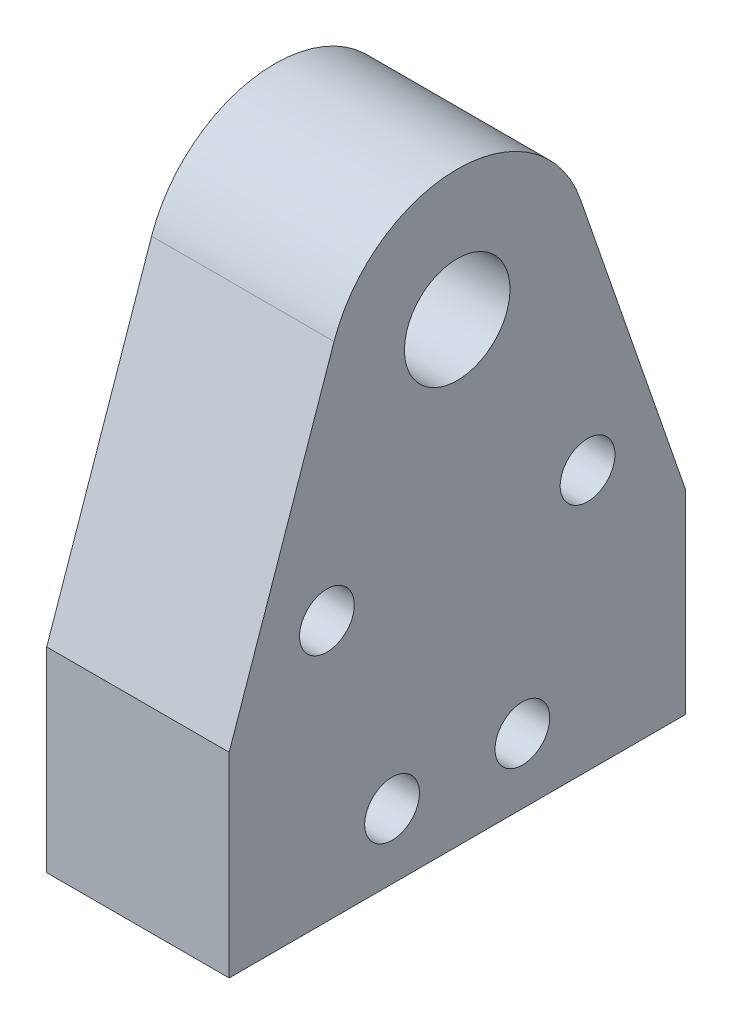
ISO-10303-21;
HEADER;
FILE_DESCRIPTION(('STEP AP214'),'2;1');
FILE_NAME('part.step','',(''),(''),'','','');
FILE_SCHEMA(('AUTOMOTIVE_DESIGN { 1 0 10303 214 1 1 1 1 }'));
ENDSEC;
DATA;
#1=APPLICATION_CONTEXT('core data for automotive mechanical design processes');
#2=APPLICATION_PROTOCOL_DEFINITION('international standard','automotive_design',2000,#1);
#3=PRODUCT_CONTEXT('',#1,'mechanical');
#4=PRODUCT('Part','Part','',(#3));
#5=PRODUCT_RELATED_PRODUCT_CATEGORY('part','',(#4));
#6=PRODUCT_DEFINITION_FORMATION('','',#4);
#7=PRODUCT_DEFINITION_CONTEXT('part definition',#1,'design');
#8=PRODUCT_DEFINITION('design','',#6,#7);
#9=PRODUCT_DEFINITION_SHAPE('','',#8);
#10=(LENGTH_UNIT() NAMED_UNIT(*) SI_UNIT(.MILLI.,.METRE.));
#11=(NAMED_UNIT(*) PLANE_ANGLE_UNIT() SI_UNIT($,.RADIAN.));
#12=(NAMED_UNIT(*) SI_UNIT($,.STERADIAN.) SOLID_ANGLE_UNIT());
#13=UNCERTAINTY_MEASURE_WITH_UNIT(LENGTH_MEASURE(1.E-05),#10,'distance_accuracy_value','');
#14=(GEOMETRIC_REPRESENTATION_CONTEXT(3) GLOBAL_UNCERTAINTY_ASSIGNED_CONTEXT((#13)) GLOBAL_UNIT_ASSIGNED_CONTEXT((#10,
#11,#12)) REPRESENTATION_CONTEXT('',''));
#15=CARTESIAN_POINT('',(0.,0.,0.));
#16=DIRECTION('',(0.,0.,1.));
#17=DIRECTION('',(1.,0.,0.));
#18=AXIS2_PLACEMENT_3D('',#15,#16,#17);
#19=CARTESIAN_POINT('',(-39.,35.,0.));
#20=DIRECTION('',(1.,0.,0.));
#21=DIRECTION('',(0.,0.,-1.));
#22=AXIS2_PLACEMENT_3D('',#19,#20,#21);
#23=CYLINDRICAL_SURFACE('',#22,4.05);
#24=CARTESIAN_POINT('',(7.,35.,0.));
#25=DIRECTION('',(1.,0.,0.));
#26=DIRECTION('',(0.,0.,-1.));
#27=AXIS2_PLACEMENT_3D('',#24,#25,#26);
#28=CIRCLE('',#27,4.05);
#29=CARTESIAN_POINT('',(7.,35.,-4.04999999999999));
#30=VERTEX_POINT('',#29);
#31=EDGE_CURVE('E181',#30,#30,#28,.T.);
#32=ORIENTED_EDGE('',*,*,#31,.T.);
#33=EDGE_LOOP('',(#32));
#34=FACE_BOUND('',#33,.T.);
#35=CARTESIAN_POINT('',(-5.,35.,0.));
#36=DIRECTION('',(-1.,0.,0.));
#37=DIRECTION('',(0.,0.,1.));
#38=AXIS2_PLACEMENT_3D('',#35,#36,#37);
#39=CIRCLE('',#38,4.05);
#40=CARTESIAN_POINT('',(-5.,35.,4.05000000000001));
#41=VERTEX_POINT('',#40);
#42=EDGE_CURVE('E12',#41,#41,#39,.F.);
#43=ORIENTED_EDGE('',*,*,#42,.F.);
#44=EDGE_LOOP('',(#43));
#45=FACE_BOUND('',#44,.T.);
#46=ADVANCED_FACE('F42',(#34,#45),#23,.F.);
#47=CARTESIAN_POINT('',(7.,60.,17.5));
#48=DIRECTION('',(-1.,0.,0.));
#49=DIRECTION('',(0.,0.,1.));
#50=AXIS2_PLACEMENT_3D('',#47,#48,#49);
#51=PLANE('',#50);
#52=CARTESIAN_POINT('',(7.,20.,10.));
#53=DIRECTION('',(1.,0.,0.));
#54=DIRECTION('',(0.,0.,-1.));
#55=AXIS2_PLACEMENT_3D('',#52,#53,#54);
#56=CIRCLE('',#55,2.1);
#57=CARTESIAN_POINT('',(7.,20.,7.9));
#58=VERTEX_POINT('',#57);
#59=EDGE_CURVE('E171',#58,#58,#56,.T.);
#60=ORIENTED_EDGE('',*,*,#59,.F.);
#61=EDGE_LOOP('',(#60));
#62=FACE_BOUND('',#61,.T.);
#63=CARTESIAN_POINT('',(7.,20.,-10.));
#64=DIRECTION('',(1.,0.,0.));
#65=DIRECTION('',(0.,0.,-1.));
#66=AXIS2_PLACEMENT_3D('',#63,#64,#65);
#67=CIRCLE('',#66,2.1);
#68=CARTESIAN_POINT('',(7.,20.,-12.1));
#69=VERTEX_POINT('',#68);
#70=EDGE_CURVE('E416',#69,#69,#67,.T.);
#71=ORIENTED_EDGE('',*,*,#70,.F.);
#72=EDGE_LOOP('',(#71));
#73=FACE_BOUND('',#72,.T.);
#74=CARTESIAN_POINT('',(7.,4.99999999999999,-5.));
#75=DIRECTION('',(1.,0.,0.));
#76=DIRECTION('',(0.,0.,-1.));
#77=AXIS2_PLACEMENT_3D('',#74,#75,#76);
#78=CIRCLE('',#77,2.1);
#79=CARTESIAN_POINT('',(7.,4.99999999999999,-7.1));
#80=VERTEX_POINT('',#79);
#81=EDGE_CURVE('E420',#80,#80,#78,.T.);
#82=ORIENTED_EDGE('',*,*,#81,.F.);
#83=EDGE_LOOP('',(#82));
#84=FACE_BOUND('',#83,.T.);
#85=CARTESIAN_POINT('',(7.,4.99999999999999,5.));
#86=DIRECTION('',(1.,0.,0.));
#87=DIRECTION('',(0.,0.,-1.));
#88=AXIS2_PLACEMENT_3D('',#85,#86,#87);
#89=CIRCLE('',#88,2.1);
#90=CARTESIAN_POINT('',(7.,4.99999999999999,2.9));
#91=VERTEX_POINT('',#90);
#92=EDGE_CURVE('E194',#91,#91,#89,.T.);
#93=ORIENTED_EDGE('',*,*,#92,.F.);
#94=EDGE_LOOP('',(#93));
#95=FACE_BOUND('',#94,.T.);
#96=ORIENTED_EDGE('',*,*,#31,.F.);
#97=EDGE_LOOP('',(#96));
#98=FACE_BOUND('',#97,.T.);
#99=CARTESIAN_POINT('',(7.,35.,0.));
#100=DIRECTION('',(1.,0.,0.));
#101=DIRECTION('',(0.,0.,-1.));
#102=AXIS2_PLACEMENT_3D('',#99,#100,#101);
#103=CIRCLE('',#102,10.);
#104=CARTESIAN_POINT('',(7.,38.2692039480153,-9.45051879773175));
#105=VERTEX_POINT('',#104);
#106=CARTESIAN_POINT('',(7.,38.2692039480153,9.45051879773176));
#107=VERTEX_POINT('',#106);
#108=EDGE_CURVE('E113',#105,#107,#103,.T.);
#109=ORIENTED_EDGE('',*,*,#108,.T.);
#110=DIRECTION('',(0.,0.945051879773176,-0.326920394801528));
#111=VECTOR('',#110,1.);
#112=CARTESIAN_POINT('',(7.,7.00989700681684,20.2640044752498));
#113=LINE('',#112,#111);
#114=CARTESIAN_POINT('',(7.,15.,17.5));
#115=VERTEX_POINT('',#114);
#116=EDGE_CURVE('E110',#115,#107,#113,.T.);
#117=ORIENTED_EDGE('',*,*,#116,.F.);
#118=DIRECTION('',(0.,-1.,0.));
#119=VECTOR('',#118,1.);
#120=CARTESIAN_POINT('',(7.,60.,17.5));
#121=LINE('',#120,#119);
#122=CARTESIAN_POINT('',(7.,0.,17.5));
#123=VERTEX_POINT('',#122);
#124=EDGE_CURVE('E66',#115,#123,#121,.T.);
#125=ORIENTED_EDGE('',*,*,#124,.T.);
#126=DIRECTION('',(0.,0.,-1.));
#127=VECTOR('',#126,1.);
#128=CARTESIAN_POINT('',(7.,0.,17.5));
#129=LINE('',#128,#127);
#130=CARTESIAN_POINT('',(7.,0.,-17.5));
#131=VERTEX_POINT('',#130);
#132=EDGE_CURVE('E139',#123,#131,#129,.T.);
#133=ORIENTED_EDGE('',*,*,#132,.T.);
#134=DIRECTION('',(0.,-1.,0.));
#135=VECTOR('',#134,1.);
#136=CARTESIAN_POINT('',(7.,60.,-17.5));
#137=LINE('',#136,#135);
#138=CARTESIAN_POINT('',(7.,15.,-17.5));
#139=VERTEX_POINT('',#138);
#140=EDGE_CURVE('E121',#139,#131,#137,.T.);
#141=ORIENTED_EDGE('',*,*,#140,.F.);
#142=DIRECTION('',(0.,-0.945051879773176,-0.326920394801529));
#143=VECTOR('',#142,1.);
#144=CARTESIAN_POINT('',(7.,7.00989700681685,-20.2640044752498));
#145=LINE('',#144,#143);
#146=EDGE_CURVE('E102',#105,#139,#145,.T.);
#147=ORIENTED_EDGE('',*,*,#146,.F.);
#148=EDGE_LOOP('',(#109,#117,#125,#133,#141,#147));
#149=FACE_BOUND('',#148,.T.);
#150=ADVANCED_FACE('F44',(#62,#73,#84,#95,#98,#149),#51,.F.);
#151=CARTESIAN_POINT('',(-7.,60.,-17.5));
#152=DIRECTION('',(0.,0.,1.));
#153=DIRECTION('',(1.,0.,0.));
#154=AXIS2_PLACEMENT_3D('',#151,#152,#153);
#155=PLANE('',#154);
#156=DIRECTION('',(0.,-1.,0.));
#157=VECTOR('',#156,1.);
#158=CARTESIAN_POINT('',(-7.,60.,-17.5));
#159=LINE('',#158,#157);
#160=CARTESIAN_POINT('',(-7.,15.,-17.5));
#161=VERTEX_POINT('',#160);
#162=CARTESIAN_POINT('',(-7.,0.,-17.5));
#163=VERTEX_POINT('',#162);
#164=EDGE_CURVE('E158',#161,#163,#159,.T.);
#165=ORIENTED_EDGE('',*,*,#164,.F.);
#166=DIRECTION('',(1.,0.,0.));
#167=VECTOR('',#166,1.);
#168=CARTESIAN_POINT('',(-53.,15.,-17.5));
#169=LINE('',#168,#167);
#170=EDGE_CURVE('E109',#161,#139,#169,.T.);
#171=ORIENTED_EDGE('',*,*,#170,.T.);
#172=ORIENTED_EDGE('',*,*,#140,.T.);
#173=DIRECTION('',(-1.,0.,0.));
#174=VECTOR('',#173,1.);
#175=CARTESIAN_POINT('',(-7.,0.,-17.5));
#176=LINE('',#175,#174);
#177=EDGE_CURVE('E142',#131,#163,#176,.T.);
#178=ORIENTED_EDGE('',*,*,#177,.T.);
#179=EDGE_LOOP('',(#165,#171,#172,#178));
#180=FACE_BOUND('',#179,.T.);
#181=ADVANCED_FACE('F228',(#180),#155,.F.);
#182=CARTESIAN_POINT('',(-7.,60.,17.5));
#183=DIRECTION('',(1.,0.,0.));
#184=DIRECTION('',(0.,0.,-1.));
#185=AXIS2_PLACEMENT_3D('',#182,#183,#184);
#186=PLANE('',#185);
#187=CARTESIAN_POINT('',(-7.00000000000001,20.,10.));
#188=DIRECTION('',(1.,0.,0.));
#189=DIRECTION('',(0.,0.,-1.));
#190=AXIS2_PLACEMENT_3D('',#187,#188,#189);
#191=CIRCLE('',#190,2.1);
#192=CARTESIAN_POINT('',(-7.00000000000001,20.,7.9));
#193=VERTEX_POINT('',#192);
#194=EDGE_CURVE('E178',#193,#193,#191,.T.);
#195=ORIENTED_EDGE('',*,*,#194,.T.);
#196=EDGE_LOOP('',(#195));
#197=FACE_BOUND('',#196,.T.);
#198=CARTESIAN_POINT('',(-7.00000000000001,20.,-10.));
#199=DIRECTION('',(1.,0.,0.));
#200=DIRECTION('',(0.,0.,-1.));
#201=AXIS2_PLACEMENT_3D('',#198,#199,#200);
#202=CIRCLE('',#201,2.1);
#203=CARTESIAN_POINT('',(-7.00000000000001,20.,-12.1));
#204=VERTEX_POINT('',#203);
#205=EDGE_CURVE('E175',#204,#204,#202,.T.);
#206=ORIENTED_EDGE('',*,*,#205,.T.);
#207=EDGE_LOOP('',(#206));
#208=FACE_BOUND('',#207,.T.);
#209=CARTESIAN_POINT('',(-7.00000000000001,4.99999999999999,-5.));
#210=DIRECTION('',(1.,0.,0.));
#211=DIRECTION('',(0.,0.,-1.));
#212=AXIS2_PLACEMENT_3D('',#209,#210,#211);
#213=CIRCLE('',#212,2.1);
#214=CARTESIAN_POINT('',(-7.00000000000001,4.99999999999999,-7.1));
#215=VERTEX_POINT('',#214);
#216=EDGE_CURVE('E170',#215,#215,#213,.T.);
#217=ORIENTED_EDGE('',*,*,#216,.T.);
#218=EDGE_LOOP('',(#217));
#219=FACE_BOUND('',#218,.T.);
#220=CARTESIAN_POINT('',(-7.00000000000001,4.99999999999999,5.));
#221=DIRECTION('',(1.,0.,0.));
#222=DIRECTION('',(0.,0.,-1.));
#223=AXIS2_PLACEMENT_3D('',#220,#221,#222);
#224=CIRCLE('',#223,2.1);
#225=CARTESIAN_POINT('',(-7.00000000000001,4.99999999999999,2.9));
#226=VERTEX_POINT('',#225);
#227=EDGE_CURVE('E166',#226,#226,#224,.T.);
#228=ORIENTED_EDGE('',*,*,#227,.T.);
#229=EDGE_LOOP('',(#228));
#230=FACE_BOUND('',#229,.T.);
#231=DIRECTION('',(0.,-1.,0.));
#232=VECTOR('',#231,1.);
#233=CARTESIAN_POINT('',(-7.,60.,17.5));
#234=LINE('',#233,#232);
#235=CARTESIAN_POINT('',(-7.,15.,17.5));
#236=VERTEX_POINT('',#235);
#237=CARTESIAN_POINT('',(-7.,0.,17.5));
#238=VERTEX_POINT('',#237);
#239=EDGE_CURVE('E155',#236,#238,#234,.T.);
#240=ORIENTED_EDGE('',*,*,#239,.F.);
#241=DIRECTION('',(0.,0.945051879773176,-0.326920394801528));
#242=VECTOR('',#241,1.);
#243=CARTESIAN_POINT('',(-7.,55.1905374958266,3.59694698604821));
#244=LINE('',#243,#242);
#245=CARTESIAN_POINT('',(-7.,38.2692039480153,9.45051879773176));
#246=VERTEX_POINT('',#245);
#247=EDGE_CURVE('E58',#236,#246,#244,.T.);
#248=ORIENTED_EDGE('',*,*,#247,.T.);
#249=CARTESIAN_POINT('',(-7.,35.,0.));
#250=DIRECTION('',(1.,0.,0.));
#251=DIRECTION('',(0.,0.,-1.));
#252=AXIS2_PLACEMENT_3D('',#249,#250,#251);
#253=CIRCLE('',#252,10.);
#254=CARTESIAN_POINT('',(-7.,38.2692039480153,-9.45051879773175));
#255=VERTEX_POINT('',#254);
#256=EDGE_CURVE('E51',#255,#246,#253,.T.);
#257=ORIENTED_EDGE('',*,*,#256,.F.);
#258=DIRECTION('',(0.,-0.945051879773176,-0.326920394801529));
#259=VECTOR('',#258,1.);
#260=CARTESIAN_POINT('',(-7.,66.0040231733446,0.143746072753366));
#261=LINE('',#260,#259);
#262=EDGE_CURVE('E105',#255,#161,#261,.T.);
#263=ORIENTED_EDGE('',*,*,#262,.T.);
#264=ORIENTED_EDGE('',*,*,#164,.T.);
#265=DIRECTION('',(0.,0.,1.));
#266=VECTOR('',#265,1.);
#267=CARTESIAN_POINT('',(-7.,0.,17.5));
#268=LINE('',#267,#266);
#269=EDGE_CURVE('E146',#163,#238,#268,.T.);
#270=ORIENTED_EDGE('',*,*,#269,.T.);
#271=EDGE_LOOP('',(#240,#248,#257,#263,#264,#270));
#272=FACE_BOUND('',#271,.T.);
#273=ADVANCED_FACE('F231',(#197,#208,#219,#230,#272),#186,.F.);
#274=CARTESIAN_POINT('',(-7.,60.,17.5));
#275=DIRECTION('',(0.,0.,-1.));
#276=DIRECTION('',(-1.,0.,0.));
#277=AXIS2_PLACEMENT_3D('',#274,#275,#276);
#278=PLANE('',#277);
#279=ORIENTED_EDGE('',*,*,#124,.F.);
#280=DIRECTION('',(1.,0.,0.));
#281=VECTOR('',#280,1.);
#282=CARTESIAN_POINT('',(-53.,15.,17.5));
#283=LINE('',#282,#281);
#284=EDGE_CURVE('E132',#236,#115,#283,.T.);
#285=ORIENTED_EDGE('',*,*,#284,.F.);
#286=ORIENTED_EDGE('',*,*,#239,.T.);
#287=DIRECTION('',(1.,0.,0.));
#288=VECTOR('',#287,1.);
#289=CARTESIAN_POINT('',(-7.,0.,17.5));
#290=LINE('',#289,#288);
#291=EDGE_CURVE('E150',#238,#123,#290,.T.);
#292=ORIENTED_EDGE('',*,*,#291,.T.);
#293=EDGE_LOOP('',(#279,#285,#286,#292));
#294=FACE_BOUND('',#293,.T.);
#295=ADVANCED_FACE('F219',(#294),#278,.F.);
#296=CARTESIAN_POINT('',(0.,0.,0.));
#297=DIRECTION('',(0.,-1.,0.));
#298=DIRECTION('',(0.,0.,-1.));
#299=AXIS2_PLACEMENT_3D('',#296,#297,#298);
#300=PLANE('',#299);
#301=CARTESIAN_POINT('',(0.,0.,12.5));
#302=DIRECTION('',(0.,-1.,0.));
#303=DIRECTION('',(0.,0.,-1.));
#304=AXIS2_PLACEMENT_3D('',#301,#302,#303);
#305=CIRCLE('',#304,2.1);
#306=CARTESIAN_POINT('',(0.,0.,10.4));
#307=VERTEX_POINT('',#306);
#308=EDGE_CURVE('E199',#307,#307,#305,.T.);
#309=ORIENTED_EDGE('',*,*,#308,.F.);
#310=EDGE_LOOP('',(#309));
#311=FACE_BOUND('',#310,.T.);
#312=CARTESIAN_POINT('',(0.,0.,-12.5));
#313=DIRECTION('',(0.,-1.,0.));
#314=DIRECTION('',(0.,0.,-1.));
#315=AXIS2_PLACEMENT_3D('',#312,#313,#314);
#316=CIRCLE('',#315,2.1);
#317=CARTESIAN_POINT('',(0.,0.,-14.6));
#318=VERTEX_POINT('',#317);
#319=EDGE_CURVE('E185',#318,#318,#316,.T.);
#320=ORIENTED_EDGE('',*,*,#319,.F.);
#321=EDGE_LOOP('',(#320));
#322=FACE_BOUND('',#321,.T.);
#323=ORIENTED_EDGE('',*,*,#132,.F.);
#324=ORIENTED_EDGE('',*,*,#291,.F.);
#325=ORIENTED_EDGE('',*,*,#269,.F.);
#326=ORIENTED_EDGE('',*,*,#177,.F.);
#327=EDGE_LOOP('',(#323,#324,#325,#326));
#328=FACE_BOUND('',#327,.T.);
#329=ADVANCED_FACE('F216',(#311,#322,#328),#300,.T.);
#330=CARTESIAN_POINT('',(-53.,35.,0.));
#331=DIRECTION('',(1.,0.,0.));
#332=DIRECTION('',(0.,0.,-1.));
#333=AXIS2_PLACEMENT_3D('',#330,#331,#332);
#334=CYLINDRICAL_SURFACE('',#333,10.);
#335=ORIENTED_EDGE('',*,*,#256,.T.);
#336=DIRECTION('',(1.,0.,0.));
#337=VECTOR('',#336,1.);
#338=CARTESIAN_POINT('',(-53.,38.2692039480153,9.45051879773176));
#339=LINE('',#338,#337);
#340=EDGE_CURVE('E115',#246,#107,#339,.T.);
#341=ORIENTED_EDGE('',*,*,#340,.T.);
#342=ORIENTED_EDGE('',*,*,#108,.F.);
#343=DIRECTION('',(1.,0.,0.));
#344=VECTOR('',#343,1.);
#345=CARTESIAN_POINT('',(-53.,38.2692039480153,-9.45051879773175));
#346=LINE('',#345,#344);
#347=EDGE_CURVE('E98',#255,#105,#346,.T.);
#348=ORIENTED_EDGE('',*,*,#347,.F.);
#349=EDGE_LOOP('',(#335,#341,#342,#348));
#350=FACE_BOUND('',#349,.T.);
#351=ADVANCED_FACE('F114',(#350),#334,.T.);
#352=CARTESIAN_POINT('',(-53.,7.00989700681685,-20.2640044752498));
#353=DIRECTION('',(0.,-0.326920394801529,0.945051879773176));
#354=DIRECTION('',(0.,-0.945051879773176,-0.326920394801529));
#355=AXIS2_PLACEMENT_3D('',#352,#353,#354);
#356=PLANE('',#355);
#357=ORIENTED_EDGE('',*,*,#347,.T.);
#358=ORIENTED_EDGE('',*,*,#146,.T.);
#359=ORIENTED_EDGE('',*,*,#170,.F.);
#360=ORIENTED_EDGE('',*,*,#262,.F.);
#361=EDGE_LOOP('',(#357,#358,#359,#360));
#362=FACE_BOUND('',#361,.T.);
#363=ADVANCED_FACE('F100',(#362),#356,.F.);
#364=CARTESIAN_POINT('',(-53.,7.00989700681684,20.2640044752498));
#365=DIRECTION('',(0.,-0.326920394801528,-0.945051879773176));
#366=DIRECTION('',(0.,0.945051879773176,-0.326920394801528));
#367=AXIS2_PLACEMENT_3D('',#364,#365,#366);
#368=PLANE('',#367);
#369=ORIENTED_EDGE('',*,*,#284,.T.);
#370=ORIENTED_EDGE('',*,*,#116,.T.);
#371=ORIENTED_EDGE('',*,*,#340,.F.);
#372=ORIENTED_EDGE('',*,*,#247,.F.);
#373=EDGE_LOOP('',(#369,#370,#371,#372));
#374=FACE_BOUND('',#373,.T.);
#375=ADVANCED_FACE('F212',(#374),#368,.F.);
#376=CARTESIAN_POINT('',(0.,10.,-12.5));
#377=DIRECTION('',(0.,-1.,0.));
#378=DIRECTION('',(0.,0.,-1.));
#379=AXIS2_PLACEMENT_3D('',#376,#377,#378);
#380=CYLINDRICAL_SURFACE('',#379,2.1);
#381=CARTESIAN_POINT('',(0.,10.,-12.5));
#382=DIRECTION('',(0.,-1.,0.));
#383=DIRECTION('',(0.,0.,-1.));
#384=AXIS2_PLACEMENT_3D('',#381,#382,#383);
#385=CIRCLE('',#384,2.1);
#386=CARTESIAN_POINT('',(0.,10.,-14.6));
#387=VERTEX_POINT('',#386);
#388=EDGE_CURVE('E191',#387,#387,#385,.T.);
#389=ORIENTED_EDGE('',*,*,#388,.F.);
#390=EDGE_LOOP('',(#389));
#391=FACE_BOUND('',#390,.T.);
#392=ORIENTED_EDGE('',*,*,#319,.T.);
#393=EDGE_LOOP('',(#392));
#394=FACE_BOUND('',#393,.T.);
#395=ADVANCED_FACE('F209',(#391,#394),#380,.F.);
#396=CARTESIAN_POINT('',(0.,10.,0.));
#397=DIRECTION('',(0.,-1.,0.));
#398=DIRECTION('',(0.,0.,-1.));
#399=AXIS2_PLACEMENT_3D('',#396,#397,#398);
#400=PLANE('',#399);
#401=ORIENTED_EDGE('',*,*,#388,.T.);
#402=EDGE_LOOP('',(#401));
#403=FACE_BOUND('',#402,.T.);
#404=ADVANCED_FACE('F207',(#403),#400,.T.);
#405=CARTESIAN_POINT('',(0.,10.,12.5));
#406=DIRECTION('',(0.,-1.,0.));
#407=DIRECTION('',(0.,0.,-1.));
#408=AXIS2_PLACEMENT_3D('',#405,#406,#407);
#409=CYLINDRICAL_SURFACE('',#408,2.1);
#410=CARTESIAN_POINT('',(0.,10.,12.5));
#411=DIRECTION('',(0.,-1.,0.));
#412=DIRECTION('',(0.,0.,-1.));
#413=AXIS2_PLACEMENT_3D('',#410,#411,#412);
#414=CIRCLE('',#413,2.1);
#415=CARTESIAN_POINT('',(0.,10.,10.4));
#416=VERTEX_POINT('',#415);
#417=EDGE_CURVE('E118',#416,#416,#414,.T.);
#418=ORIENTED_EDGE('',*,*,#417,.F.);
#419=EDGE_LOOP('',(#418));
#420=FACE_BOUND('',#419,.T.);
#421=ORIENTED_EDGE('',*,*,#308,.T.);
#422=EDGE_LOOP('',(#421));
#423=FACE_BOUND('',#422,.T.);
#424=ADVANCED_FACE('F253',(#420,#423),#409,.F.);
#425=CARTESIAN_POINT('',(0.,10.,0.));
#426=DIRECTION('',(0.,-1.,0.));
#427=DIRECTION('',(0.,0.,-1.));
#428=AXIS2_PLACEMENT_3D('',#425,#426,#427);
#429=PLANE('',#428);
#430=ORIENTED_EDGE('',*,*,#417,.T.);
#431=EDGE_LOOP('',(#430));
#432=FACE_BOUND('',#431,.T.);
#433=ADVANCED_FACE('F250',(#432),#429,.T.);
#434=CARTESIAN_POINT('',(-93.,4.99999999999999,5.));
#435=DIRECTION('',(1.,0.,0.));
#436=DIRECTION('',(0.,0.,-1.));
#437=AXIS2_PLACEMENT_3D('',#434,#435,#436);
#438=CYLINDRICAL_SURFACE('',#437,2.1);
#439=ORIENTED_EDGE('',*,*,#92,.T.);
#440=EDGE_LOOP('',(#439));
#441=FACE_BOUND('',#440,.T.);
#442=ORIENTED_EDGE('',*,*,#227,.F.);
#443=EDGE_LOOP('',(#442));
#444=FACE_BOUND('',#443,.T.);
#445=ADVANCED_FACE('F248',(#441,#444),#438,.F.);
#446=CARTESIAN_POINT('',(-93.,4.99999999999999,-5.));
#447=DIRECTION('',(1.,0.,0.));
#448=DIRECTION('',(0.,0.,-1.));
#449=AXIS2_PLACEMENT_3D('',#446,#447,#448);
#450=CYLINDRICAL_SURFACE('',#449,2.1);
#451=ORIENTED_EDGE('',*,*,#81,.T.);
#452=EDGE_LOOP('',(#451));
#453=FACE_BOUND('',#452,.T.);
#454=ORIENTED_EDGE('',*,*,#216,.F.);
#455=EDGE_LOOP('',(#454));
#456=FACE_BOUND('',#455,.T.);
#457=ADVANCED_FACE('F292',(#453,#456),#450,.F.);
#458=CARTESIAN_POINT('',(-93.,20.,-10.));
#459=DIRECTION('',(1.,0.,0.));
#460=DIRECTION('',(0.,0.,-1.));
#461=AXIS2_PLACEMENT_3D('',#458,#459,#460);
#462=CYLINDRICAL_SURFACE('',#461,2.1);
#463=ORIENTED_EDGE('',*,*,#70,.T.);
#464=EDGE_LOOP('',(#463));
#465=FACE_BOUND('',#464,.T.);
#466=ORIENTED_EDGE('',*,*,#205,.F.);
#467=EDGE_LOOP('',(#466));
#468=FACE_BOUND('',#467,.T.);
#469=ADVANCED_FACE('F298',(#465,#468),#462,.F.);
#470=CARTESIAN_POINT('',(-93.,20.,10.));
#471=DIRECTION('',(1.,0.,0.));
#472=DIRECTION('',(0.,0.,-1.));
#473=AXIS2_PLACEMENT_3D('',#470,#471,#472);
#474=CYLINDRICAL_SURFACE('',#473,2.1);
#475=ORIENTED_EDGE('',*,*,#59,.T.);
#476=EDGE_LOOP('',(#475));
#477=FACE_BOUND('',#476,.T.);
#478=ORIENTED_EDGE('',*,*,#194,.F.);
#479=EDGE_LOOP('',(#478));
#480=FACE_BOUND('',#479,.T.);
#481=ADVANCED_FACE('F304',(#477,#480),#474,.F.);
#482=CARTESIAN_POINT('',(-5.,35.,0.));
#483=DIRECTION('',(-1.,0.,0.));
#484=DIRECTION('',(0.,0.,1.));
#485=AXIS2_PLACEMENT_3D('',#482,#483,#484);
#486=PLANE('',#485);
#487=ORIENTED_EDGE('',*,*,#42,.T.);
#488=EDGE_LOOP('',(#487));
#489=FACE_BOUND('',#488,.T.);
#490=ADVANCED_FACE('F311',(#489),#486,.F.);
#491=CLOSED_SHELL('',(#46,#150,#181,#273,#295,#329,#351,#363,#375,#395,#404,#424,#433,#445,#457,
#469,#481,#490));
#492=MANIFOLD_SOLID_BREP('B2',#491);
#493=ADVANCED_BREP_SHAPE_REPRESENTATION('',(#18,#492),#14);
#494=SHAPE_DEFINITION_REPRESENTATION(#9,#493);
ENDSEC;
END-ISO-10303-21;
